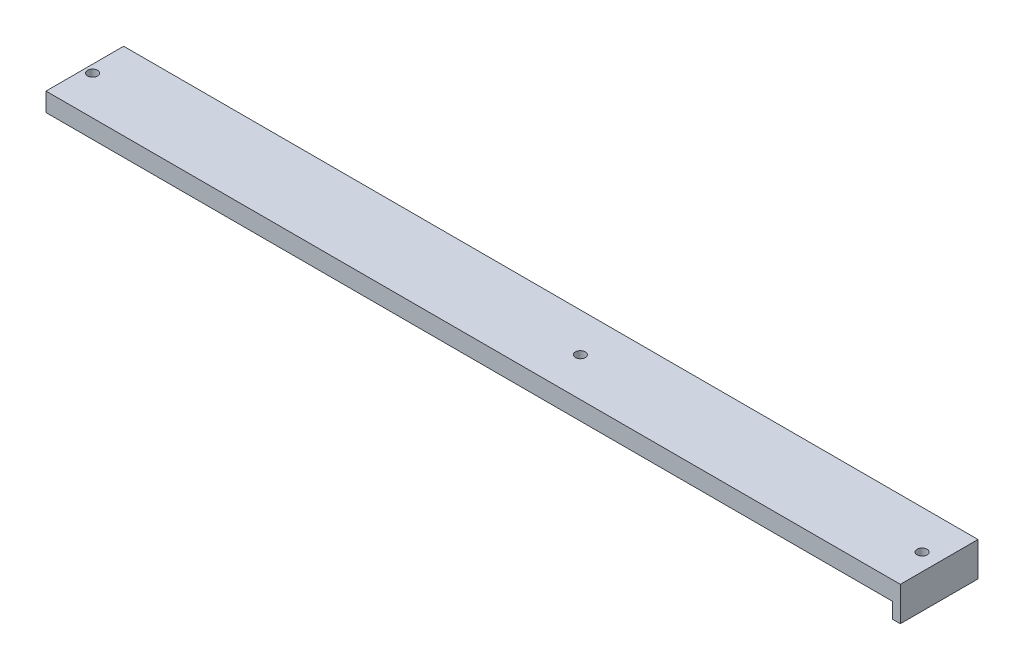
ISO-10303-21;
HEADER;
FILE_DESCRIPTION(('STEP AP214'),'2;1');
FILE_NAME('part.step','',(''),(''),'','','');
FILE_SCHEMA(('AUTOMOTIVE_DESIGN { 1 0 10303 214 1 1 1 1 }'));
ENDSEC;
DATA;
#1=APPLICATION_CONTEXT('core data for automotive mechanical design processes');
#2=APPLICATION_PROTOCOL_DEFINITION('international standard','automotive_design',2000,#1);
#3=PRODUCT_CONTEXT('',#1,'mechanical');
#4=PRODUCT('Part','Part','',(#3));
#5=PRODUCT_RELATED_PRODUCT_CATEGORY('part','',(#4));
#6=PRODUCT_DEFINITION_FORMATION('','',#4);
#7=PRODUCT_DEFINITION_CONTEXT('part definition',#1,'design');
#8=PRODUCT_DEFINITION('design','',#6,#7);
#9=PRODUCT_DEFINITION_SHAPE('','',#8);
#10=(LENGTH_UNIT() NAMED_UNIT(*) SI_UNIT(.MILLI.,.METRE.));
#11=(NAMED_UNIT(*) PLANE_ANGLE_UNIT() SI_UNIT($,.RADIAN.));
#12=(NAMED_UNIT(*) SI_UNIT($,.STERADIAN.) SOLID_ANGLE_UNIT());
#13=UNCERTAINTY_MEASURE_WITH_UNIT(LENGTH_MEASURE(1.E-05),#10,'distance_accuracy_value','');
#14=(GEOMETRIC_REPRESENTATION_CONTEXT(3) GLOBAL_UNCERTAINTY_ASSIGNED_CONTEXT((#13)) GLOBAL_UNIT_ASSIGNED_CONTEXT((#10,
#11,#12)) REPRESENTATION_CONTEXT('',''));
#15=CARTESIAN_POINT('',(0.,0.,0.));
#16=DIRECTION('',(0.,0.,1.));
#17=DIRECTION('',(1.,0.,0.));
#18=AXIS2_PLACEMENT_3D('',#15,#16,#17);
#19=CARTESIAN_POINT('',(0.,0.,0.));
#20=DIRECTION('',(0.,1.,0.));
#21=DIRECTION('',(0.,0.,1.));
#22=AXIS2_PLACEMENT_3D('',#19,#20,#21);
#23=PLANE('',#22);
#24=CARTESIAN_POINT('',(21.9999999999999,0.,0.));
#25=DIRECTION('',(0.,1.,0.));
#26=DIRECTION('',(0.,0.,1.));
#27=AXIS2_PLACEMENT_3D('',#24,#25,#26);
#28=CIRCLE('',#27,1.6);
#29=CARTESIAN_POINT('',(21.9999999999999,0.,1.6));
#30=VERTEX_POINT('',#29);
#31=EDGE_CURVE('E139',#30,#30,#28,.F.);
#32=ORIENTED_EDGE('',*,*,#31,.F.);
#33=EDGE_LOOP('',(#32));
#34=FACE_BOUND('',#33,.T.);
#35=CARTESIAN_POINT('',(-135.,0.,0.));
#36=DIRECTION('',(0.,1.,0.));
#37=DIRECTION('',(0.,0.,1.));
#38=AXIS2_PLACEMENT_3D('',#35,#36,#37);
#39=CIRCLE('',#38,1.59999999999999);
#40=CARTESIAN_POINT('',(-135.,0.,1.59999999999999));
#41=VERTEX_POINT('',#40);
#42=EDGE_CURVE('E172',#41,#41,#39,.T.);
#43=ORIENTED_EDGE('',*,*,#42,.T.);
#44=EDGE_LOOP('',(#43));
#45=FACE_BOUND('',#44,.T.);
#46=CARTESIAN_POINT('',(132.,0.,0.));
#47=DIRECTION('',(0.,1.,0.));
#48=DIRECTION('',(0.,0.,1.));
#49=AXIS2_PLACEMENT_3D('',#46,#47,#48);
#50=CIRCLE('',#49,1.59999999999999);
#51=CARTESIAN_POINT('',(132.,0.,1.60000000000005));
#52=VERTEX_POINT('',#51);
#53=EDGE_CURVE('E133',#52,#52,#50,.T.);
#54=ORIENTED_EDGE('',*,*,#53,.T.);
#55=EDGE_LOOP('',(#54));
#56=FACE_BOUND('',#55,.T.);
#57=DIRECTION('',(0.,0.,-1.));
#58=VECTOR('',#57,1.);
#59=CARTESIAN_POINT('',(135.,0.,12.5));
#60=LINE('',#59,#58);
#61=CARTESIAN_POINT('',(135.,0.,12.5));
#62=VERTEX_POINT('',#61);
#63=CARTESIAN_POINT('',(135.,0.,-12.5));
#64=VERTEX_POINT('',#63);
#65=EDGE_CURVE('E57',#62,#64,#60,.T.);
#66=ORIENTED_EDGE('',*,*,#65,.F.);
#67=DIRECTION('',(1.,0.,0.));
#68=VECTOR('',#67,1.);
#69=CARTESIAN_POINT('',(0.,0.,12.5));
#70=LINE('',#69,#68);
#71=CARTESIAN_POINT('',(-137.5,0.,12.5));
#72=VERTEX_POINT('',#71);
#73=EDGE_CURVE('E162',#72,#62,#70,.T.);
#74=ORIENTED_EDGE('',*,*,#73,.F.);
#75=DIRECTION('',(0.,0.,-1.));
#76=VECTOR('',#75,1.);
#77=CARTESIAN_POINT('',(-137.5,0.,0.));
#78=LINE('',#77,#76);
#79=CARTESIAN_POINT('',(-137.5,0.,-12.5));
#80=VERTEX_POINT('',#79);
#81=EDGE_CURVE('E168',#72,#80,#78,.T.);
#82=ORIENTED_EDGE('',*,*,#81,.T.);
#83=DIRECTION('',(1.,0.,0.));
#84=VECTOR('',#83,1.);
#85=CARTESIAN_POINT('',(0.,0.,-12.5));
#86=LINE('',#85,#84);
#87=EDGE_CURVE('E165',#80,#64,#86,.T.);
#88=ORIENTED_EDGE('',*,*,#87,.T.);
#89=EDGE_LOOP('',(#66,#74,#82,#88));
#90=FACE_BOUND('',#89,.T.);
#91=ADVANCED_FACE('F41',(#34,#45,#56,#90),#23,.F.);
#92=CARTESIAN_POINT('',(0.,6.,12.5));
#93=DIRECTION('',(0.,0.,-1.));
#94=DIRECTION('',(-1.,0.,0.));
#95=AXIS2_PLACEMENT_3D('',#92,#93,#94);
#96=PLANE('',#95);
#97=ORIENTED_EDGE('',*,*,#73,.T.);
#98=DIRECTION('',(0.,1.,0.));
#99=VECTOR('',#98,1.);
#100=CARTESIAN_POINT('',(135.,-5.,12.5));
#101=LINE('',#100,#99);
#102=CARTESIAN_POINT('',(135.,-5.,12.5));
#103=VERTEX_POINT('',#102);
#104=EDGE_CURVE('E108',#103,#62,#101,.T.);
#105=ORIENTED_EDGE('',*,*,#104,.F.);
#106=DIRECTION('',(-1.,0.,0.));
#107=VECTOR('',#106,1.);
#108=CARTESIAN_POINT('',(137.5,-5.,12.5));
#109=LINE('',#108,#107);
#110=CARTESIAN_POINT('',(137.5,-5.,12.5));
#111=VERTEX_POINT('',#110);
#112=EDGE_CURVE('E105',#111,#103,#109,.T.);
#113=ORIENTED_EDGE('',*,*,#112,.F.);
#114=DIRECTION('',(0.,-1.,0.));
#115=VECTOR('',#114,1.);
#116=CARTESIAN_POINT('',(137.5,6.,12.5));
#117=LINE('',#116,#115);
#118=CARTESIAN_POINT('',(137.5,6.,12.5));
#119=VERTEX_POINT('',#118);
#120=EDGE_CURVE('E11',#119,#111,#117,.T.);
#121=ORIENTED_EDGE('',*,*,#120,.F.);
#122=DIRECTION('',(1.,0.,0.));
#123=VECTOR('',#122,1.);
#124=CARTESIAN_POINT('',(0.,6.,12.5));
#125=LINE('',#124,#123);
#126=CARTESIAN_POINT('',(-137.5,6.,12.5));
#127=VERTEX_POINT('',#126);
#128=EDGE_CURVE('E138',#127,#119,#125,.T.);
#129=ORIENTED_EDGE('',*,*,#128,.F.);
#130=DIRECTION('',(0.,-1.,0.));
#131=VECTOR('',#130,1.);
#132=CARTESIAN_POINT('',(-137.5,6.,12.5));
#133=LINE('',#132,#131);
#134=EDGE_CURVE('E66',#127,#72,#133,.T.);
#135=ORIENTED_EDGE('',*,*,#134,.T.);
#136=EDGE_LOOP('',(#97,#105,#113,#121,#129,#135));
#137=FACE_BOUND('',#136,.T.);
#138=ADVANCED_FACE('F106',(#137),#96,.F.);
#139=CARTESIAN_POINT('',(137.5,6.,0.));
#140=DIRECTION('',(-1.,0.,0.));
#141=DIRECTION('',(0.,0.,1.));
#142=AXIS2_PLACEMENT_3D('',#139,#140,#141);
#143=PLANE('',#142);
#144=ORIENTED_EDGE('',*,*,#120,.T.);
#145=DIRECTION('',(0.,0.,1.));
#146=VECTOR('',#145,1.);
#147=CARTESIAN_POINT('',(137.5,-5.,12.5));
#148=LINE('',#147,#146);
#149=CARTESIAN_POINT('',(137.5,-5.,-12.5));
#150=VERTEX_POINT('',#149);
#151=EDGE_CURVE('E103',#150,#111,#148,.T.);
#152=ORIENTED_EDGE('',*,*,#151,.F.);
#153=DIRECTION('',(0.,-1.,0.));
#154=VECTOR('',#153,1.);
#155=CARTESIAN_POINT('',(137.5,6.,-12.5));
#156=LINE('',#155,#154);
#157=CARTESIAN_POINT('',(137.5,6.,-12.5));
#158=VERTEX_POINT('',#157);
#159=EDGE_CURVE('E50',#158,#150,#156,.T.);
#160=ORIENTED_EDGE('',*,*,#159,.F.);
#161=DIRECTION('',(0.,0.,-1.));
#162=VECTOR('',#161,1.);
#163=CARTESIAN_POINT('',(137.5,6.,0.));
#164=LINE('',#163,#162);
#165=EDGE_CURVE('E84',#119,#158,#164,.T.);
#166=ORIENTED_EDGE('',*,*,#165,.F.);
#167=EDGE_LOOP('',(#144,#152,#160,#166));
#168=FACE_BOUND('',#167,.T.);
#169=ADVANCED_FACE('F101',(#168),#143,.F.);
#170=CARTESIAN_POINT('',(0.,6.,-12.5));
#171=DIRECTION('',(0.,0.,-1.));
#172=DIRECTION('',(-1.,0.,0.));
#173=AXIS2_PLACEMENT_3D('',#170,#171,#172);
#174=PLANE('',#173);
#175=ORIENTED_EDGE('',*,*,#87,.F.);
#176=DIRECTION('',(0.,-1.,0.));
#177=VECTOR('',#176,1.);
#178=CARTESIAN_POINT('',(-137.5,6.,-12.5));
#179=LINE('',#178,#177);
#180=CARTESIAN_POINT('',(-137.5,6.,-12.5));
#181=VERTEX_POINT('',#180);
#182=EDGE_CURVE('E181',#181,#80,#179,.T.);
#183=ORIENTED_EDGE('',*,*,#182,.F.);
#184=DIRECTION('',(1.,0.,0.));
#185=VECTOR('',#184,1.);
#186=CARTESIAN_POINT('',(0.,6.,-12.5));
#187=LINE('',#186,#185);
#188=EDGE_CURVE('E144',#181,#158,#187,.T.);
#189=ORIENTED_EDGE('',*,*,#188,.T.);
#190=ORIENTED_EDGE('',*,*,#159,.T.);
#191=DIRECTION('',(1.,0.,0.));
#192=VECTOR('',#191,1.);
#193=CARTESIAN_POINT('',(137.5,-5.,-12.5));
#194=LINE('',#193,#192);
#195=CARTESIAN_POINT('',(135.,-5.,-12.5));
#196=VERTEX_POINT('',#195);
#197=EDGE_CURVE('E117',#196,#150,#194,.T.);
#198=ORIENTED_EDGE('',*,*,#197,.F.);
#199=DIRECTION('',(0.,1.,0.));
#200=VECTOR('',#199,1.);
#201=CARTESIAN_POINT('',(135.,-5.,-12.5));
#202=LINE('',#201,#200);
#203=EDGE_CURVE('E126',#196,#64,#202,.T.);
#204=ORIENTED_EDGE('',*,*,#203,.T.);
#205=EDGE_LOOP('',(#175,#183,#189,#190,#198,#204));
#206=FACE_BOUND('',#205,.T.);
#207=ADVANCED_FACE('F186',(#206),#174,.T.);
#208=CARTESIAN_POINT('',(-135.,6.,0.));
#209=DIRECTION('',(0.,-1.,0.));
#210=DIRECTION('',(0.,0.,-1.));
#211=AXIS2_PLACEMENT_3D('',#208,#209,#210);
#212=CYLINDRICAL_SURFACE('',#211,1.59999999999999);
#213=CARTESIAN_POINT('',(-135.,6.,0.));
#214=DIRECTION('',(0.,1.,0.));
#215=DIRECTION('',(0.,0.,1.));
#216=AXIS2_PLACEMENT_3D('',#213,#214,#215);
#217=CIRCLE('',#216,1.59999999999999);
#218=CARTESIAN_POINT('',(-135.,6.,1.59999999999999));
#219=VERTEX_POINT('',#218);
#220=EDGE_CURVE('E151',#219,#219,#217,.T.);
#221=ORIENTED_EDGE('',*,*,#220,.T.);
#222=EDGE_LOOP('',(#221));
#223=FACE_BOUND('',#222,.T.);
#224=ORIENTED_EDGE('',*,*,#42,.F.);
#225=EDGE_LOOP('',(#224));
#226=FACE_BOUND('',#225,.T.);
#227=ADVANCED_FACE('F218',(#223,#226),#212,.F.);
#228=CARTESIAN_POINT('',(-137.5,6.,0.));
#229=DIRECTION('',(-1.,0.,0.));
#230=DIRECTION('',(0.,0.,1.));
#231=AXIS2_PLACEMENT_3D('',#228,#229,#230);
#232=PLANE('',#231);
#233=ORIENTED_EDGE('',*,*,#81,.F.);
#234=ORIENTED_EDGE('',*,*,#134,.F.);
#235=DIRECTION('',(0.,0.,-1.));
#236=VECTOR('',#235,1.);
#237=CARTESIAN_POINT('',(-137.5,6.,0.));
#238=LINE('',#237,#236);
#239=EDGE_CURVE('E148',#127,#181,#238,.T.);
#240=ORIENTED_EDGE('',*,*,#239,.T.);
#241=ORIENTED_EDGE('',*,*,#182,.T.);
#242=EDGE_LOOP('',(#233,#234,#240,#241));
#243=FACE_BOUND('',#242,.T.);
#244=ADVANCED_FACE('F192',(#243),#232,.T.);
#245=CARTESIAN_POINT('',(132.,6.,0.));
#246=DIRECTION('',(0.,-1.,0.));
#247=DIRECTION('',(0.,0.,-1.));
#248=AXIS2_PLACEMENT_3D('',#245,#246,#247);
#249=CYLINDRICAL_SURFACE('',#248,1.59999999999999);
#250=CARTESIAN_POINT('',(132.,6.,0.));
#251=DIRECTION('',(0.,1.,0.));
#252=DIRECTION('',(0.,0.,1.));
#253=AXIS2_PLACEMENT_3D('',#250,#251,#252);
#254=CIRCLE('',#253,1.59999999999999);
#255=CARTESIAN_POINT('',(132.,6.,1.60000000000005));
#256=VERTEX_POINT('',#255);
#257=EDGE_CURVE('E134',#256,#256,#254,.T.);
#258=ORIENTED_EDGE('',*,*,#257,.T.);
#259=EDGE_LOOP('',(#258));
#260=FACE_BOUND('',#259,.T.);
#261=ORIENTED_EDGE('',*,*,#53,.F.);
#262=EDGE_LOOP('',(#261));
#263=FACE_BOUND('',#262,.T.);
#264=ADVANCED_FACE('F43',(#260,#263),#249,.F.);
#265=CARTESIAN_POINT('',(21.9999999999999,6.,0.));
#266=DIRECTION('',(0.,-1.,0.));
#267=DIRECTION('',(0.,0.,-1.));
#268=AXIS2_PLACEMENT_3D('',#265,#266,#267);
#269=CYLINDRICAL_SURFACE('',#268,1.6);
#270=CARTESIAN_POINT('',(21.9999999999999,6.,0.));
#271=DIRECTION('',(0.,1.,0.));
#272=DIRECTION('',(0.,0.,1.));
#273=AXIS2_PLACEMENT_3D('',#270,#271,#272);
#274=CIRCLE('',#273,1.6);
#275=CARTESIAN_POINT('',(21.9999999999999,6.,1.6));
#276=VERTEX_POINT('',#275);
#277=EDGE_CURVE('E155',#276,#276,#274,.F.);
#278=ORIENTED_EDGE('',*,*,#277,.F.);
#279=EDGE_LOOP('',(#278));
#280=FACE_BOUND('',#279,.T.);
#281=ORIENTED_EDGE('',*,*,#31,.T.);
#282=EDGE_LOOP('',(#281));
#283=FACE_BOUND('',#282,.T.);
#284=ADVANCED_FACE('F203',(#280,#283),#269,.F.);
#285=CARTESIAN_POINT('',(0.,6.,0.));
#286=DIRECTION('',(0.,1.,0.));
#287=DIRECTION('',(0.,0.,1.));
#288=AXIS2_PLACEMENT_3D('',#285,#286,#287);
#289=PLANE('',#288);
#290=ORIENTED_EDGE('',*,*,#257,.F.);
#291=EDGE_LOOP('',(#290));
#292=FACE_BOUND('',#291,.T.);
#293=ORIENTED_EDGE('',*,*,#128,.T.);
#294=ORIENTED_EDGE('',*,*,#165,.T.);
#295=ORIENTED_EDGE('',*,*,#188,.F.);
#296=ORIENTED_EDGE('',*,*,#239,.F.);
#297=EDGE_LOOP('',(#293,#294,#295,#296));
#298=FACE_BOUND('',#297,.T.);
#299=ORIENTED_EDGE('',*,*,#220,.F.);
#300=EDGE_LOOP('',(#299));
#301=FACE_BOUND('',#300,.T.);
#302=ORIENTED_EDGE('',*,*,#277,.T.);
#303=EDGE_LOOP('',(#302));
#304=FACE_BOUND('',#303,.T.);
#305=ADVANCED_FACE('F190',(#292,#298,#301,#304),#289,.T.);
#306=CARTESIAN_POINT('',(135.,-5.,12.5));
#307=DIRECTION('',(1.,0.,0.));
#308=DIRECTION('',(0.,0.,-1.));
#309=AXIS2_PLACEMENT_3D('',#306,#307,#308);
#310=PLANE('',#309);
#311=ORIENTED_EDGE('',*,*,#65,.T.);
#312=ORIENTED_EDGE('',*,*,#203,.F.);
#313=DIRECTION('',(0.,0.,-1.));
#314=VECTOR('',#313,1.);
#315=CARTESIAN_POINT('',(135.,-5.,12.5));
#316=LINE('',#315,#314);
#317=EDGE_CURVE('E112',#103,#196,#316,.T.);
#318=ORIENTED_EDGE('',*,*,#317,.F.);
#319=ORIENTED_EDGE('',*,*,#104,.T.);
#320=EDGE_LOOP('',(#311,#312,#318,#319));
#321=FACE_BOUND('',#320,.T.);
#322=ADVANCED_FACE('F195',(#321),#310,.F.);
#323=CARTESIAN_POINT('',(0.,-5.,0.));
#324=DIRECTION('',(0.,1.,0.));
#325=DIRECTION('',(0.,0.,1.));
#326=AXIS2_PLACEMENT_3D('',#323,#324,#325);
#327=PLANE('',#326);
#328=ORIENTED_EDGE('',*,*,#151,.T.);
#329=ORIENTED_EDGE('',*,*,#112,.T.);
#330=ORIENTED_EDGE('',*,*,#317,.T.);
#331=ORIENTED_EDGE('',*,*,#197,.T.);
#332=EDGE_LOOP('',(#328,#329,#330,#331));
#333=FACE_BOUND('',#332,.T.);
#334=ADVANCED_FACE('F115',(#333),#327,.F.);
#335=CLOSED_SHELL('',(#91,#138,#169,#207,#227,#244,#264,#284,#305,#322,#334));
#336=MANIFOLD_SOLID_BREP('B2',#335);
#337=ADVANCED_BREP_SHAPE_REPRESENTATION('',(#18,#336),#14);
#338=SHAPE_DEFINITION_REPRESENTATION(#9,#337);
ENDSEC;
END-ISO-10303-21;
